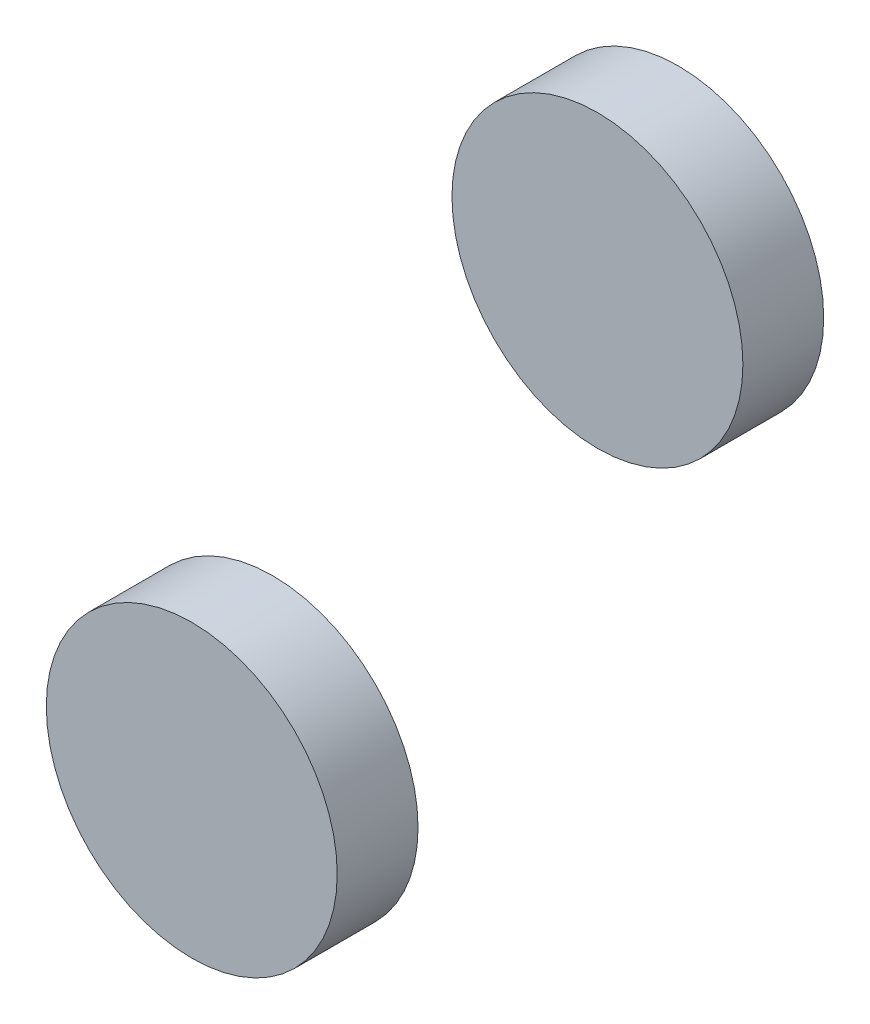
ISO-10303-21;
HEADER;
FILE_DESCRIPTION(('STEP AP214'),'2;1');
FILE_NAME('part.step','',(''),(''),'','','');
FILE_SCHEMA(('AUTOMOTIVE_DESIGN { 1 0 10303 214 1 1 1 1 }'));
ENDSEC;
DATA;
#1=APPLICATION_CONTEXT('core data for automotive mechanical design processes');
#2=APPLICATION_PROTOCOL_DEFINITION('international standard','automotive_design',2000,#1);
#3=PRODUCT_CONTEXT('',#1,'mechanical');
#4=PRODUCT('Part','Part','',(#3));
#5=PRODUCT_RELATED_PRODUCT_CATEGORY('part','',(#4));
#6=PRODUCT_DEFINITION_FORMATION('','',#4);
#7=PRODUCT_DEFINITION_CONTEXT('part definition',#1,'design');
#8=PRODUCT_DEFINITION('design','',#6,#7);
#9=PRODUCT_DEFINITION_SHAPE('','',#8);
#10=(LENGTH_UNIT() NAMED_UNIT(*) SI_UNIT(.MILLI.,.METRE.));
#11=(NAMED_UNIT(*) PLANE_ANGLE_UNIT() SI_UNIT($,.RADIAN.));
#12=(NAMED_UNIT(*) SI_UNIT($,.STERADIAN.) SOLID_ANGLE_UNIT());
#13=UNCERTAINTY_MEASURE_WITH_UNIT(LENGTH_MEASURE(1.E-05),#10,'distance_accuracy_value','');
#14=(GEOMETRIC_REPRESENTATION_CONTEXT(3) GLOBAL_UNCERTAINTY_ASSIGNED_CONTEXT((#13)) GLOBAL_UNIT_ASSIGNED_CONTEXT((#10,
#11,#12)) REPRESENTATION_CONTEXT('',''));
#15=CARTESIAN_POINT('',(0.,0.,0.));
#16=DIRECTION('',(0.,0.,1.));
#17=DIRECTION('',(1.,0.,0.));
#18=AXIS2_PLACEMENT_3D('',#15,#16,#17);
#19=CARTESIAN_POINT('',(19.3400021363873,-3.39402766761798,-0.253998963258981));
#20=DIRECTION('',(0.,-8.74227339409092E-08,1.));
#21=DIRECTION('',(1.,-8.74227765734792E-08,0.));
#22=AXIS2_PLACEMENT_3D('',#19,#20,#21);
#23=PLANE('',#22);
#24=CARTESIAN_POINT('',(19.7972021363873,-3.39402770758767,-0.253998963258985));
#25=DIRECTION('',(0.,8.74227339409092E-08,-1.));
#26=DIRECTION('',(-1.,8.74227765734792E-08,0.));
#27=AXIS2_PLACEMENT_3D('',#24,#25,#26);
#28=CIRCLE('',#27,0.4572);
#29=CARTESIAN_POINT('',(19.3400021363873,-3.39402766761798,-0.253998963258982));
#30=VERTEX_POINT('',#29);
#31=EDGE_CURVE('P0_E10',#30,#30,#28,.T.);
#32=ORIENTED_EDGE('',*,*,#31,.T.);
#33=EDGE_LOOP('',(#32));
#34=FACE_BOUND('',#33,.T.);
#35=ADVANCED_FACE('P0_F15',(#34),#23,.F.);
#36=CARTESIAN_POINT('',(19.3400021363873,-3.39402768982336,1.0367410172539E-06));
#37=DIRECTION('',(0.,-8.74227339409092E-08,1.));
#38=DIRECTION('',(1.,-8.74227765734792E-08,0.));
#39=AXIS2_PLACEMENT_3D('',#36,#37,#38);
#40=PLANE('',#39);
#41=CARTESIAN_POINT('',(19.7972021363873,-3.39402772979305,1.03674101378445E-06));
#42=DIRECTION('',(0.,8.74227339409092E-08,-1.));
#43=DIRECTION('',(-1.,8.74227765734792E-08,0.));
#44=AXIS2_PLACEMENT_3D('',#41,#42,#43);
#45=CIRCLE('',#44,0.4572);
#46=CARTESIAN_POINT('',(19.3400021363873,-3.39402768982336,1.03674101727871E-06));
#47=VERTEX_POINT('',#46);
#48=EDGE_CURVE('P0_E22',#47,#47,#45,.T.);
#49=ORIENTED_EDGE('',*,*,#48,.F.);
#50=EDGE_LOOP('',(#49));
#51=FACE_BOUND('',#50,.T.);
#52=ADVANCED_FACE('P0_F35',(#51),#40,.T.);
#53=CARTESIAN_POINT('',(19.7972021363873,-3.39402772979305,1.03674101378445E-06));
#54=DIRECTION('',(0.,-8.74227339409092E-08,1.));
#55=DIRECTION('',(-1.,8.74227765734792E-08,0.));
#56=AXIS2_PLACEMENT_3D('',#53,#54,#55);
#57=CYLINDRICAL_SURFACE('',#56,0.4572);
#58=ORIENTED_EDGE('',*,*,#31,.F.);
#59=EDGE_LOOP('',(#58));
#60=FACE_BOUND('',#59,.T.);
#61=ORIENTED_EDGE('',*,*,#48,.T.);
#62=EDGE_LOOP('',(#61));
#63=FACE_BOUND('',#62,.T.);
#64=ADVANCED_FACE('P0_F33',(#60,#63),#57,.T.);
#65=CLOSED_SHELL('',(#35,#52,#64));
#66=MANIFOLD_SOLID_BREP('P0_B1',#65);
#67=CARTESIAN_POINT('',(21.0721960383297,-0.911833811097384,-0.253998923289316));
#68=DIRECTION('',(0.,-8.74227339409095E-08,1.));
#69=DIRECTION('',(-1.19248806384999E-08,-1.,-8.74227339409095E-08));
#70=AXIS2_PLACEMENT_3D('',#67,#68,#69);
#71=PLANE('',#70);
#72=CARTESIAN_POINT('',(21.0721960328776,-1.36903381109738,-0.253998963258991));
#73=DIRECTION('',(0.,8.74227339409095E-08,-1.));
#74=DIRECTION('',(1.19248806384999E-08,1.,8.74227339409095E-08));
#75=AXIS2_PLACEMENT_3D('',#72,#73,#74);
#76=CIRCLE('',#75,0.4572);
#77=CARTESIAN_POINT('',(21.0721960383297,-0.911833811097376,-0.253998923289317));
#78=VERTEX_POINT('',#77);
#79=EDGE_CURVE('P1_E10',#78,#78,#76,.T.);
#80=ORIENTED_EDGE('',*,*,#79,.T.);
#81=EDGE_LOOP('',(#80));
#82=FACE_BOUND('',#81,.T.);
#83=ADVANCED_FACE('P1_F15',(#82),#71,.F.);
#84=CARTESIAN_POINT('',(21.0721960383297,-0.911833833302747,1.07671068285201E-06));
#85=DIRECTION('',(0.,-8.74227339409095E-08,1.));
#86=DIRECTION('',(-1.19248806384999E-08,-1.,-8.74227339409095E-08));
#87=AXIS2_PLACEMENT_3D('',#84,#85,#86);
#88=PLANE('',#87);
#89=CARTESIAN_POINT('',(21.0721960328776,-1.36903383330275,1.03674100901396E-06));
#90=DIRECTION('',(0.,8.74227339409095E-08,-1.));
#91=DIRECTION('',(1.19248806384999E-08,1.,8.74227339409095E-08));
#92=AXIS2_PLACEMENT_3D('',#89,#90,#91);
#93=CIRCLE('',#92,0.4572);
#94=CARTESIAN_POINT('',(21.0721960383297,-0.911833833302752,1.07671068297175E-06));
#95=VERTEX_POINT('',#94);
#96=EDGE_CURVE('P1_E22',#95,#95,#93,.T.);
#97=ORIENTED_EDGE('',*,*,#96,.F.);
#98=EDGE_LOOP('',(#97));
#99=FACE_BOUND('',#98,.T.);
#100=ADVANCED_FACE('P1_F35',(#99),#88,.T.);
#101=CARTESIAN_POINT('',(21.0721960328776,-1.36903383330275,1.03674100901396E-06));
#102=DIRECTION('',(0.,-8.74227339409095E-08,1.));
#103=DIRECTION('',(1.19248806384999E-08,1.,8.74227339409095E-08));
#104=AXIS2_PLACEMENT_3D('',#101,#102,#103);
#105=CYLINDRICAL_SURFACE('',#104,0.4572);
#106=ORIENTED_EDGE('',*,*,#79,.F.);
#107=EDGE_LOOP('',(#106));
#108=FACE_BOUND('',#107,.T.);
#109=ORIENTED_EDGE('',*,*,#96,.T.);
#110=EDGE_LOOP('',(#109));
#111=FACE_BOUND('',#110,.T.);
#112=ADVANCED_FACE('P1_F33',(#108,#111),#105,.T.);
#113=CLOSED_SHELL('',(#83,#100,#112));
#114=MANIFOLD_SOLID_BREP('P1_B1',#113);
#115=ADVANCED_BREP_SHAPE_REPRESENTATION('',(#18,#66,#114),#14);
#116=SHAPE_DEFINITION_REPRESENTATION(#9,#115);
ENDSEC;
END-ISO-10303-21;
